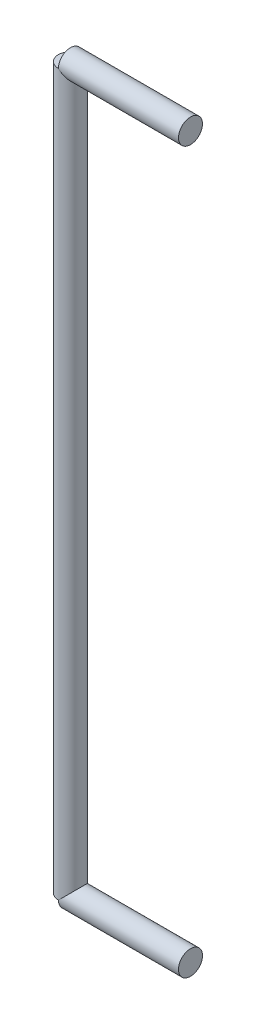
ISO-10303-21;
HEADER;
FILE_DESCRIPTION(('STEP AP214'),'2;1');
FILE_NAME('part.step','',(''),(''),'','','');
FILE_SCHEMA(('AUTOMOTIVE_DESIGN { 1 0 10303 214 1 1 1 1 }'));
ENDSEC;
DATA;
#1=APPLICATION_CONTEXT('core data for automotive mechanical design processes');
#2=APPLICATION_PROTOCOL_DEFINITION('international standard','automotive_design',2000,#1);
#3=PRODUCT_CONTEXT('',#1,'mechanical');
#4=PRODUCT('Part','Part','',(#3));
#5=PRODUCT_RELATED_PRODUCT_CATEGORY('part','',(#4));
#6=PRODUCT_DEFINITION_FORMATION('','',#4);
#7=PRODUCT_DEFINITION_CONTEXT('part definition',#1,'design');
#8=PRODUCT_DEFINITION('design','',#6,#7);
#9=PRODUCT_DEFINITION_SHAPE('','',#8);
#10=(LENGTH_UNIT() NAMED_UNIT(*) SI_UNIT(.MILLI.,.METRE.));
#11=(NAMED_UNIT(*) PLANE_ANGLE_UNIT() SI_UNIT($,.RADIAN.));
#12=(NAMED_UNIT(*) SI_UNIT($,.STERADIAN.) SOLID_ANGLE_UNIT());
#13=UNCERTAINTY_MEASURE_WITH_UNIT(LENGTH_MEASURE(1.E-05),#10,'distance_accuracy_value','');
#14=(GEOMETRIC_REPRESENTATION_CONTEXT(3) GLOBAL_UNCERTAINTY_ASSIGNED_CONTEXT((#13)) GLOBAL_UNIT_ASSIGNED_CONTEXT((#10,
#11,#12)) REPRESENTATION_CONTEXT('',''));
#15=CARTESIAN_POINT('',(0.,0.,0.));
#16=DIRECTION('',(0.,0.,1.));
#17=DIRECTION('',(1.,0.,0.));
#18=AXIS2_PLACEMENT_3D('',#15,#16,#17);
#19=CARTESIAN_POINT('',(5.,0.,0.));
#20=DIRECTION('',(-1.,0.,0.));
#21=DIRECTION('',(0.,0.,1.));
#22=AXIS2_PLACEMENT_3D('',#19,#20,#21);
#23=CYLINDRICAL_SURFACE('',#22,0.5);
#24=CARTESIAN_POINT('',(5.,0.,0.));
#25=DIRECTION('',(1.,0.,0.));
#26=DIRECTION('',(0.,0.,-1.));
#27=AXIS2_PLACEMENT_3D('',#24,#25,#26);
#28=CIRCLE('',#27,0.5);
#29=CARTESIAN_POINT('',(5.,0.,-0.5));
#30=VERTEX_POINT('',#29);
#31=EDGE_CURVE('E77',#30,#30,#28,.T.);
#32=ORIENTED_EDGE('',*,*,#31,.F.);
#33=EDGE_LOOP('',(#32));
#34=FACE_BOUND('',#33,.T.);
#35=CARTESIAN_POINT('',(0.,0.,0.));
#36=DIRECTION('',(1.,0.,0.));
#37=DIRECTION('',(0.,0.,-1.));
#38=AXIS2_PLACEMENT_3D('',#35,#36,#37);
#39=CIRCLE('',#38,0.5);
#40=CARTESIAN_POINT('',(0.,0.,0.5));
#41=VERTEX_POINT('',#40);
#42=CARTESIAN_POINT('',(0.,0.,-0.5));
#43=VERTEX_POINT('',#42);
#44=EDGE_CURVE('E78',#41,#43,#39,.T.);
#45=ORIENTED_EDGE('',*,*,#44,.T.);
#46=CARTESIAN_POINT('',(0.,0.,0.));
#47=DIRECTION('',(0.707106781186547,-0.707106781186547,0.));
#48=DIRECTION('',(-0.707106781186547,-0.707106781186547,0.));
#49=AXIS2_PLACEMENT_3D('',#46,#47,#48);
#50=ELLIPSE('',#49,0.707106781186547,0.5);
#51=EDGE_CURVE('E75',#43,#41,#50,.T.);
#52=ORIENTED_EDGE('',*,*,#51,.T.);
#53=EDGE_LOOP('',(#45,#52));
#54=FACE_BOUND('',#53,.T.);
#55=ADVANCED_FACE('F39',(#34,#54),#23,.T.);
#56=CARTESIAN_POINT('',(0.,0.,0.));
#57=DIRECTION('',(1.,0.,0.));
#58=DIRECTION('',(0.,0.,-1.));
#59=AXIS2_PLACEMENT_3D('',#56,#57,#58);
#60=PLANE('',#59);
#61=ORIENTED_EDGE('',*,*,#44,.F.);
#62=DIRECTION('',(0.,0.,-1.));
#63=VECTOR('',#62,1.);
#64=CARTESIAN_POINT('',(0.,0.,0.));
#65=LINE('',#64,#63);
#66=EDGE_CURVE('E50',#41,#43,#65,.T.);
#67=ORIENTED_EDGE('',*,*,#66,.T.);
#68=EDGE_LOOP('',(#61,#67));
#69=FACE_BOUND('',#68,.T.);
#70=ADVANCED_FACE('F76',(#69),#60,.F.);
#71=CARTESIAN_POINT('',(5.,0.,0.));
#72=DIRECTION('',(1.,0.,0.));
#73=DIRECTION('',(0.,0.,-1.));
#74=AXIS2_PLACEMENT_3D('',#71,#72,#73);
#75=PLANE('',#74);
#76=ORIENTED_EDGE('',*,*,#31,.T.);
#77=EDGE_LOOP('',(#76));
#78=FACE_BOUND('',#77,.T.);
#79=ADVANCED_FACE('F119',(#78),#75,.T.);
#80=CARTESIAN_POINT('',(0.,30.,0.));
#81=DIRECTION('',(0.,-1.,0.));
#82=DIRECTION('',(0.,0.,-1.));
#83=AXIS2_PLACEMENT_3D('',#80,#81,#82);
#84=CYLINDRICAL_SURFACE('',#83,0.5);
#85=CARTESIAN_POINT('',(0.,30.,0.));
#86=DIRECTION('',(-0.707106781186547,-0.707106781186547,0.));
#87=DIRECTION('',(0.707106781186547,-0.707106781186547,0.));
#88=AXIS2_PLACEMENT_3D('',#85,#86,#87);
#89=ELLIPSE('',#88,0.707106781186548,0.500000000000001);
#90=CARTESIAN_POINT('',(0.,30.,0.500000000000001));
#91=VERTEX_POINT('',#90);
#92=CARTESIAN_POINT('',(0.,30.,-0.5));
#93=VERTEX_POINT('',#92);
#94=EDGE_CURVE('E69',#91,#93,#89,.F.);
#95=ORIENTED_EDGE('',*,*,#94,.F.);
#96=CARTESIAN_POINT('',(0.,30.,0.));
#97=DIRECTION('',(0.,1.,0.));
#98=DIRECTION('',(0.,0.,1.));
#99=AXIS2_PLACEMENT_3D('',#96,#97,#98);
#100=CIRCLE('',#99,0.5);
#101=EDGE_CURVE('E67',#93,#91,#100,.T.);
#102=ORIENTED_EDGE('',*,*,#101,.F.);
#103=EDGE_LOOP('',(#95,#102));
#104=FACE_BOUND('',#103,.T.);
#105=ORIENTED_EDGE('',*,*,#51,.F.);
#106=CARTESIAN_POINT('',(0.,0.,0.));
#107=DIRECTION('',(0.,1.,0.));
#108=DIRECTION('',(0.,0.,1.));
#109=AXIS2_PLACEMENT_3D('',#106,#107,#108);
#110=CIRCLE('',#109,0.5);
#111=EDGE_CURVE('E61',#43,#41,#110,.T.);
#112=ORIENTED_EDGE('',*,*,#111,.T.);
#113=EDGE_LOOP('',(#105,#112));
#114=FACE_BOUND('',#113,.T.);
#115=ADVANCED_FACE('F41',(#104,#114),#84,.T.);
#116=CARTESIAN_POINT('',(0.,30.,0.));
#117=DIRECTION('',(0.,1.,0.));
#118=DIRECTION('',(0.,0.,1.));
#119=AXIS2_PLACEMENT_3D('',#116,#117,#118);
#120=PLANE('',#119);
#121=ORIENTED_EDGE('',*,*,#101,.T.);
#122=DIRECTION('',(0.,0.,-1.));
#123=VECTOR('',#122,1.);
#124=CARTESIAN_POINT('',(0.,30.,0.));
#125=LINE('',#124,#123);
#126=EDGE_CURVE('E11',#91,#93,#125,.T.);
#127=ORIENTED_EDGE('',*,*,#126,.T.);
#128=EDGE_LOOP('',(#121,#127));
#129=FACE_BOUND('',#128,.T.);
#130=ADVANCED_FACE('F91',(#129),#120,.T.);
#131=CARTESIAN_POINT('',(0.,0.,0.));
#132=DIRECTION('',(0.,1.,0.));
#133=DIRECTION('',(0.,0.,1.));
#134=AXIS2_PLACEMENT_3D('',#131,#132,#133);
#135=PLANE('',#134);
#136=ORIENTED_EDGE('',*,*,#66,.F.);
#137=ORIENTED_EDGE('',*,*,#111,.F.);
#138=EDGE_LOOP('',(#136,#137));
#139=FACE_BOUND('',#138,.T.);
#140=ADVANCED_FACE('F66',(#139),#135,.F.);
#141=CARTESIAN_POINT('',(5.,30.,0.));
#142=DIRECTION('',(-1.,0.,0.));
#143=DIRECTION('',(0.,0.,1.));
#144=AXIS2_PLACEMENT_3D('',#141,#142,#143);
#145=CYLINDRICAL_SURFACE('',#144,0.500000000000001);
#146=CARTESIAN_POINT('',(5.,30.,0.));
#147=DIRECTION('',(1.,0.,0.));
#148=DIRECTION('',(0.,0.,-1.));
#149=AXIS2_PLACEMENT_3D('',#146,#147,#148);
#150=CIRCLE('',#149,0.500000000000001);
#151=CARTESIAN_POINT('',(5.,30.,-0.500000000000001));
#152=VERTEX_POINT('',#151);
#153=EDGE_CURVE('E82',#152,#152,#150,.T.);
#154=ORIENTED_EDGE('',*,*,#153,.F.);
#155=EDGE_LOOP('',(#154));
#156=FACE_BOUND('',#155,.T.);
#157=CARTESIAN_POINT('',(0.,30.,0.));
#158=DIRECTION('',(1.,0.,0.));
#159=DIRECTION('',(0.,0.,-1.));
#160=AXIS2_PLACEMENT_3D('',#157,#158,#159);
#161=CIRCLE('',#160,0.500000000000001);
#162=EDGE_CURVE('E52',#93,#91,#161,.T.);
#163=ORIENTED_EDGE('',*,*,#162,.T.);
#164=ORIENTED_EDGE('',*,*,#94,.T.);
#165=EDGE_LOOP('',(#163,#164));
#166=FACE_BOUND('',#165,.T.);
#167=ADVANCED_FACE('F100',(#156,#166),#145,.T.);
#168=CARTESIAN_POINT('',(5.,30.,0.));
#169=DIRECTION('',(1.,0.,0.));
#170=DIRECTION('',(0.,0.,-1.));
#171=AXIS2_PLACEMENT_3D('',#168,#169,#170);
#172=PLANE('',#171);
#173=ORIENTED_EDGE('',*,*,#153,.T.);
#174=EDGE_LOOP('',(#173));
#175=FACE_BOUND('',#174,.T.);
#176=ADVANCED_FACE('F97',(#175),#172,.T.);
#177=CARTESIAN_POINT('',(0.,30.,0.));
#178=DIRECTION('',(1.,0.,0.));
#179=DIRECTION('',(0.,0.,-1.));
#180=AXIS2_PLACEMENT_3D('',#177,#178,#179);
#181=PLANE('',#180);
#182=ORIENTED_EDGE('',*,*,#126,.F.);
#183=ORIENTED_EDGE('',*,*,#162,.F.);
#184=EDGE_LOOP('',(#182,#183));
#185=FACE_BOUND('',#184,.T.);
#186=ADVANCED_FACE('F106',(#185),#181,.F.);
#187=CLOSED_SHELL('',(#55,#70,#79,#115,#130,#140,#167,#176,#186));
#188=MANIFOLD_SOLID_BREP('B2',#187);
#189=ADVANCED_BREP_SHAPE_REPRESENTATION('',(#18,#188),#14);
#190=SHAPE_DEFINITION_REPRESENTATION(#9,#189);
ENDSEC;
END-ISO-10303-21;
